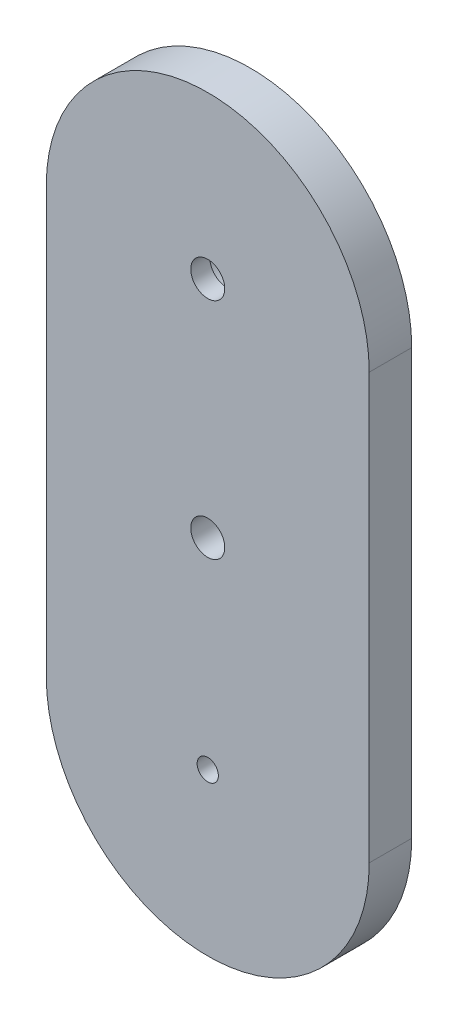
ISO-10303-21;
HEADER;
FILE_DESCRIPTION(('STEP AP214'),'2;1');
FILE_NAME('part.step','',(''),(''),'','','');
FILE_SCHEMA(('AUTOMOTIVE_DESIGN { 1 0 10303 214 1 1 1 1 }'));
ENDSEC;
DATA;
#1=APPLICATION_CONTEXT('core data for automotive mechanical design processes');
#2=APPLICATION_PROTOCOL_DEFINITION('international standard','automotive_design',2000,#1);
#3=PRODUCT_CONTEXT('',#1,'mechanical');
#4=PRODUCT('Part','Part','',(#3));
#5=PRODUCT_RELATED_PRODUCT_CATEGORY('part','',(#4));
#6=PRODUCT_DEFINITION_FORMATION('','',#4);
#7=PRODUCT_DEFINITION_CONTEXT('part definition',#1,'design');
#8=PRODUCT_DEFINITION('design','',#6,#7);
#9=PRODUCT_DEFINITION_SHAPE('','',#8);
#10=(LENGTH_UNIT() NAMED_UNIT(*) SI_UNIT(.MILLI.,.METRE.));
#11=(NAMED_UNIT(*) PLANE_ANGLE_UNIT() SI_UNIT($,.RADIAN.));
#12=(NAMED_UNIT(*) SI_UNIT($,.STERADIAN.) SOLID_ANGLE_UNIT());
#13=UNCERTAINTY_MEASURE_WITH_UNIT(LENGTH_MEASURE(1.E-05),#10,'distance_accuracy_value','');
#14=(GEOMETRIC_REPRESENTATION_CONTEXT(3) GLOBAL_UNCERTAINTY_ASSIGNED_CONTEXT((#13)) GLOBAL_UNIT_ASSIGNED_CONTEXT((#10,
#11,#12)) REPRESENTATION_CONTEXT('',''));
#15=CARTESIAN_POINT('',(0.,0.,0.));
#16=DIRECTION('',(0.,0.,1.));
#17=DIRECTION('',(1.,0.,0.));
#18=AXIS2_PLACEMENT_3D('',#15,#16,#17);
#19=CARTESIAN_POINT('',(0.,100.,10.));
#20=DIRECTION('',(0.,0.,-1.));
#21=DIRECTION('',(-1.,0.,0.));
#22=AXIS2_PLACEMENT_3D('',#19,#20,#21);
#23=CYLINDRICAL_SURFACE('',#22,8.);
#24=CARTESIAN_POINT('',(0.,100.,0.));
#25=DIRECTION('',(0.,0.,1.));
#26=DIRECTION('',(1.,0.,0.));
#27=AXIS2_PLACEMENT_3D('',#24,#25,#26);
#28=CIRCLE('',#27,8.);
#29=CARTESIAN_POINT('',(8.,100.,0.));
#30=VERTEX_POINT('',#29);
#31=EDGE_CURVE('E119',#30,#30,#28,.T.);
#32=ORIENTED_EDGE('',*,*,#31,.F.);
#33=EDGE_LOOP('',(#32));
#34=FACE_BOUND('',#33,.T.);
#35=CARTESIAN_POINT('',(0.,100.,5.5));
#36=DIRECTION('',(0.,0.,1.));
#37=DIRECTION('',(1.,0.,0.));
#38=AXIS2_PLACEMENT_3D('',#35,#36,#37);
#39=CIRCLE('',#38,8.);
#40=CARTESIAN_POINT('',(8.,100.,5.5));
#41=VERTEX_POINT('',#40);
#42=EDGE_CURVE('E153',#41,#41,#39,.T.);
#43=ORIENTED_EDGE('',*,*,#42,.T.);
#44=EDGE_LOOP('',(#43));
#45=FACE_BOUND('',#44,.T.);
#46=ADVANCED_FACE('F45',(#34,#45),#23,.F.);
#47=CARTESIAN_POINT('',(0.,0.,10.));
#48=DIRECTION('',(0.,0.,1.));
#49=DIRECTION('',(1.,0.,0.));
#50=AXIS2_PLACEMENT_3D('',#47,#48,#49);
#51=PLANE('',#50);
#52=CARTESIAN_POINT('',(0.,0.,10.));
#53=DIRECTION('',(0.,0.,1.));
#54=DIRECTION('',(1.,0.,0.));
#55=AXIS2_PLACEMENT_3D('',#52,#53,#54);
#56=CIRCLE('',#55,2.5);
#57=CARTESIAN_POINT('',(2.5,0.,10.));
#58=VERTEX_POINT('',#57);
#59=EDGE_CURVE('E140',#58,#58,#56,.T.);
#60=ORIENTED_EDGE('',*,*,#59,.F.);
#61=EDGE_LOOP('',(#60));
#62=FACE_BOUND('',#61,.T.);
#63=CARTESIAN_POINT('',(0.,0.,10.));
#64=DIRECTION('',(0.,0.,1.));
#65=DIRECTION('',(1.,0.,0.));
#66=AXIS2_PLACEMENT_3D('',#63,#64,#65);
#67=CIRCLE('',#66,38.);
#68=CARTESIAN_POINT('',(-38.,0.,10.));
#69=VERTEX_POINT('',#68);
#70=CARTESIAN_POINT('',(38.,0.,10.));
#71=VERTEX_POINT('',#70);
#72=EDGE_CURVE('E99',#69,#71,#67,.T.);
#73=ORIENTED_EDGE('',*,*,#72,.T.);
#74=DIRECTION('',(0.,1.,0.));
#75=VECTOR('',#74,1.);
#76=CARTESIAN_POINT('',(38.,0.,10.));
#77=LINE('',#76,#75);
#78=CARTESIAN_POINT('',(38.,100.,10.));
#79=VERTEX_POINT('',#78);
#80=EDGE_CURVE('E93',#71,#79,#77,.T.);
#81=ORIENTED_EDGE('',*,*,#80,.T.);
#82=CARTESIAN_POINT('',(0.,100.,10.));
#83=DIRECTION('',(0.,0.,1.));
#84=DIRECTION('',(1.,0.,0.));
#85=AXIS2_PLACEMENT_3D('',#82,#83,#84);
#86=CIRCLE('',#85,38.);
#87=CARTESIAN_POINT('',(-38.,100.,10.));
#88=VERTEX_POINT('',#87);
#89=EDGE_CURVE('E97',#79,#88,#86,.T.);
#90=ORIENTED_EDGE('',*,*,#89,.T.);
#91=DIRECTION('',(0.,-1.,0.));
#92=VECTOR('',#91,1.);
#93=CARTESIAN_POINT('',(-38.,0.,10.));
#94=LINE('',#93,#92);
#95=EDGE_CURVE('E63',#88,#69,#94,.T.);
#96=ORIENTED_EDGE('',*,*,#95,.T.);
#97=EDGE_LOOP('',(#73,#81,#90,#96));
#98=FACE_BOUND('',#97,.T.);
#99=CARTESIAN_POINT('',(-1.02049907716852E-13,47.25,10.));
#100=DIRECTION('',(0.,0.,1.));
#101=DIRECTION('',(1.,0.,0.));
#102=AXIS2_PLACEMENT_3D('',#99,#100,#101);
#103=CIRCLE('',#102,4.);
#104=CARTESIAN_POINT('',(3.9999999999999,47.25,10.));
#105=VERTEX_POINT('',#104);
#106=EDGE_CURVE('E145',#105,#105,#103,.T.);
#107=ORIENTED_EDGE('',*,*,#106,.F.);
#108=EDGE_LOOP('',(#107));
#109=FACE_BOUND('',#108,.T.);
#110=CARTESIAN_POINT('',(0.,100.,10.));
#111=DIRECTION('',(0.,0.,1.));
#112=DIRECTION('',(1.,0.,0.));
#113=AXIS2_PLACEMENT_3D('',#110,#111,#112);
#114=CIRCLE('',#113,4.);
#115=CARTESIAN_POINT('',(4.,100.,10.));
#116=VERTEX_POINT('',#115);
#117=EDGE_CURVE('E161',#116,#116,#114,.T.);
#118=ORIENTED_EDGE('',*,*,#117,.F.);
#119=EDGE_LOOP('',(#118));
#120=FACE_BOUND('',#119,.T.);
#121=ADVANCED_FACE('F94',(#62,#98,#109,#120),#51,.T.);
#122=CARTESIAN_POINT('',(0.,0.,0.));
#123=DIRECTION('',(0.,0.,1.));
#124=DIRECTION('',(1.,0.,0.));
#125=AXIS2_PLACEMENT_3D('',#122,#123,#124);
#126=PLANE('',#125);
#127=CARTESIAN_POINT('',(0.,0.,0.));
#128=DIRECTION('',(0.,0.,1.));
#129=DIRECTION('',(1.,0.,0.));
#130=AXIS2_PLACEMENT_3D('',#127,#128,#129);
#131=CIRCLE('',#130,38.);
#132=CARTESIAN_POINT('',(-38.,0.,0.));
#133=VERTEX_POINT('',#132);
#134=CARTESIAN_POINT('',(38.,0.,0.));
#135=VERTEX_POINT('',#134);
#136=EDGE_CURVE('E115',#133,#135,#131,.T.);
#137=ORIENTED_EDGE('',*,*,#136,.F.);
#138=DIRECTION('',(0.,-1.,0.));
#139=VECTOR('',#138,1.);
#140=CARTESIAN_POINT('',(-38.,0.,0.));
#141=LINE('',#140,#139);
#142=CARTESIAN_POINT('',(-38.,100.,0.));
#143=VERTEX_POINT('',#142);
#144=EDGE_CURVE('E86',#143,#133,#141,.T.);
#145=ORIENTED_EDGE('',*,*,#144,.F.);
#146=CARTESIAN_POINT('',(0.,100.,0.));
#147=DIRECTION('',(0.,0.,1.));
#148=DIRECTION('',(1.,0.,0.));
#149=AXIS2_PLACEMENT_3D('',#146,#147,#148);
#150=CIRCLE('',#149,38.);
#151=CARTESIAN_POINT('',(38.,100.,0.));
#152=VERTEX_POINT('',#151);
#153=EDGE_CURVE('E80',#152,#143,#150,.T.);
#154=ORIENTED_EDGE('',*,*,#153,.F.);
#155=DIRECTION('',(0.,1.,0.));
#156=VECTOR('',#155,1.);
#157=CARTESIAN_POINT('',(38.,0.,0.));
#158=LINE('',#157,#156);
#159=EDGE_CURVE('E104',#135,#152,#158,.T.);
#160=ORIENTED_EDGE('',*,*,#159,.F.);
#161=EDGE_LOOP('',(#137,#145,#154,#160));
#162=FACE_BOUND('',#161,.T.);
#163=ORIENTED_EDGE('',*,*,#31,.T.);
#164=EDGE_LOOP('',(#163));
#165=FACE_BOUND('',#164,.T.);
#166=CARTESIAN_POINT('',(0.,0.,0.));
#167=DIRECTION('',(0.,0.,1.));
#168=DIRECTION('',(1.,0.,0.));
#169=AXIS2_PLACEMENT_3D('',#166,#167,#168);
#170=CIRCLE('',#169,2.5);
#171=CARTESIAN_POINT('',(2.5,0.,0.));
#172=VERTEX_POINT('',#171);
#173=EDGE_CURVE('E141',#172,#172,#170,.T.);
#174=ORIENTED_EDGE('',*,*,#173,.T.);
#175=EDGE_LOOP('',(#174));
#176=FACE_BOUND('',#175,.T.);
#177=CARTESIAN_POINT('',(-1.02049907716852E-13,47.25,0.));
#178=DIRECTION('',(0.,0.,1.));
#179=DIRECTION('',(1.,0.,0.));
#180=AXIS2_PLACEMENT_3D('',#177,#178,#179);
#181=CIRCLE('',#180,4.);
#182=CARTESIAN_POINT('',(3.9999999999999,47.25,0.));
#183=VERTEX_POINT('',#182);
#184=EDGE_CURVE('E149',#183,#183,#181,.T.);
#185=ORIENTED_EDGE('',*,*,#184,.T.);
#186=EDGE_LOOP('',(#185));
#187=FACE_BOUND('',#186,.T.);
#188=ADVANCED_FACE('F132',(#162,#165,#176,#187),#126,.F.);
#189=CARTESIAN_POINT('',(0.,0.,10.));
#190=DIRECTION('',(0.,0.,-1.));
#191=DIRECTION('',(-1.,0.,0.));
#192=AXIS2_PLACEMENT_3D('',#189,#190,#191);
#193=CYLINDRICAL_SURFACE('',#192,38.);
#194=ORIENTED_EDGE('',*,*,#136,.T.);
#195=DIRECTION('',(0.,0.,-1.));
#196=VECTOR('',#195,1.);
#197=CARTESIAN_POINT('',(38.,0.,10.));
#198=LINE('',#197,#196);
#199=EDGE_CURVE('E11',#71,#135,#198,.T.);
#200=ORIENTED_EDGE('',*,*,#199,.F.);
#201=ORIENTED_EDGE('',*,*,#72,.F.);
#202=DIRECTION('',(0.,0.,-1.));
#203=VECTOR('',#202,1.);
#204=CARTESIAN_POINT('',(-38.,0.,10.));
#205=LINE('',#204,#203);
#206=EDGE_CURVE('E111',#69,#133,#205,.T.);
#207=ORIENTED_EDGE('',*,*,#206,.T.);
#208=EDGE_LOOP('',(#194,#200,#201,#207));
#209=FACE_BOUND('',#208,.T.);
#210=ADVANCED_FACE('F47',(#209),#193,.T.);
#211=CARTESIAN_POINT('',(38.,0.,10.));
#212=DIRECTION('',(-1.,0.,0.));
#213=DIRECTION('',(0.,0.,1.));
#214=AXIS2_PLACEMENT_3D('',#211,#212,#213);
#215=PLANE('',#214);
#216=ORIENTED_EDGE('',*,*,#159,.T.);
#217=DIRECTION('',(0.,0.,-1.));
#218=VECTOR('',#217,1.);
#219=CARTESIAN_POINT('',(38.,100.,10.));
#220=LINE('',#219,#218);
#221=EDGE_CURVE('E55',#79,#152,#220,.T.);
#222=ORIENTED_EDGE('',*,*,#221,.F.);
#223=ORIENTED_EDGE('',*,*,#80,.F.);
#224=ORIENTED_EDGE('',*,*,#199,.T.);
#225=EDGE_LOOP('',(#216,#222,#223,#224));
#226=FACE_BOUND('',#225,.T.);
#227=ADVANCED_FACE('F103',(#226),#215,.F.);
#228=CARTESIAN_POINT('',(0.,100.,10.));
#229=DIRECTION('',(0.,0.,-1.));
#230=DIRECTION('',(-1.,0.,0.));
#231=AXIS2_PLACEMENT_3D('',#228,#229,#230);
#232=CYLINDRICAL_SURFACE('',#231,38.);
#233=ORIENTED_EDGE('',*,*,#153,.T.);
#234=DIRECTION('',(0.,0.,-1.));
#235=VECTOR('',#234,1.);
#236=CARTESIAN_POINT('',(-38.,100.,10.));
#237=LINE('',#236,#235);
#238=EDGE_CURVE('E106',#88,#143,#237,.T.);
#239=ORIENTED_EDGE('',*,*,#238,.F.);
#240=ORIENTED_EDGE('',*,*,#89,.F.);
#241=ORIENTED_EDGE('',*,*,#221,.T.);
#242=EDGE_LOOP('',(#233,#239,#240,#241));
#243=FACE_BOUND('',#242,.T.);
#244=ADVANCED_FACE('F107',(#243),#232,.T.);
#245=CARTESIAN_POINT('',(-38.,0.,10.));
#246=DIRECTION('',(1.,0.,0.));
#247=DIRECTION('',(0.,0.,-1.));
#248=AXIS2_PLACEMENT_3D('',#245,#246,#247);
#249=PLANE('',#248);
#250=ORIENTED_EDGE('',*,*,#144,.T.);
#251=ORIENTED_EDGE('',*,*,#206,.F.);
#252=ORIENTED_EDGE('',*,*,#95,.F.);
#253=ORIENTED_EDGE('',*,*,#238,.T.);
#254=EDGE_LOOP('',(#250,#251,#252,#253));
#255=FACE_BOUND('',#254,.T.);
#256=ADVANCED_FACE('F129',(#255),#249,.F.);
#257=CARTESIAN_POINT('',(0.,0.,10.));
#258=DIRECTION('',(0.,0.,-1.));
#259=DIRECTION('',(-1.,0.,0.));
#260=AXIS2_PLACEMENT_3D('',#257,#258,#259);
#261=CYLINDRICAL_SURFACE('',#260,2.5);
#262=ORIENTED_EDGE('',*,*,#59,.T.);
#263=EDGE_LOOP('',(#262));
#264=FACE_BOUND('',#263,.T.);
#265=ORIENTED_EDGE('',*,*,#173,.F.);
#266=EDGE_LOOP('',(#265));
#267=FACE_BOUND('',#266,.T.);
#268=ADVANCED_FACE('F194',(#264,#267),#261,.F.);
#269=CARTESIAN_POINT('',(-1.02049907716852E-13,47.25,10.));
#270=DIRECTION('',(0.,0.,-1.));
#271=DIRECTION('',(-1.,0.,0.));
#272=AXIS2_PLACEMENT_3D('',#269,#270,#271);
#273=CYLINDRICAL_SURFACE('',#272,4.);
#274=ORIENTED_EDGE('',*,*,#106,.T.);
#275=EDGE_LOOP('',(#274));
#276=FACE_BOUND('',#275,.T.);
#277=ORIENTED_EDGE('',*,*,#184,.F.);
#278=EDGE_LOOP('',(#277));
#279=FACE_BOUND('',#278,.T.);
#280=ADVANCED_FACE('F228',(#276,#279),#273,.F.);
#281=CARTESIAN_POINT('',(0.,100.,5.5));
#282=DIRECTION('',(0.,0.,1.));
#283=DIRECTION('',(1.,0.,0.));
#284=AXIS2_PLACEMENT_3D('',#281,#282,#283);
#285=PLANE('',#284);
#286=CARTESIAN_POINT('',(0.,100.,5.5));
#287=DIRECTION('',(0.,0.,1.));
#288=DIRECTION('',(1.,0.,0.));
#289=AXIS2_PLACEMENT_3D('',#286,#287,#288);
#290=CIRCLE('',#289,4.);
#291=CARTESIAN_POINT('',(4.,100.,5.5));
#292=VERTEX_POINT('',#291);
#293=EDGE_CURVE('E160',#292,#292,#290,.T.);
#294=ORIENTED_EDGE('',*,*,#293,.T.);
#295=EDGE_LOOP('',(#294));
#296=FACE_BOUND('',#295,.T.);
#297=ORIENTED_EDGE('',*,*,#42,.F.);
#298=EDGE_LOOP('',(#297));
#299=FACE_BOUND('',#298,.T.);
#300=ADVANCED_FACE('F169',(#296,#299),#285,.F.);
#301=CARTESIAN_POINT('',(0.,100.,5.5));
#302=DIRECTION('',(0.,0.,1.));
#303=DIRECTION('',(1.,0.,0.));
#304=AXIS2_PLACEMENT_3D('',#301,#302,#303);
#305=CYLINDRICAL_SURFACE('',#304,4.);
#306=ORIENTED_EDGE('',*,*,#293,.F.);
#307=EDGE_LOOP('',(#306));
#308=FACE_BOUND('',#307,.T.);
#309=ORIENTED_EDGE('',*,*,#117,.T.);
#310=EDGE_LOOP('',(#309));
#311=FACE_BOUND('',#310,.T.);
#312=ADVANCED_FACE('F172',(#308,#311),#305,.F.);
#313=CLOSED_SHELL('',(#46,#121,#188,#210,#227,#244,#256,#268,#280,#300,#312));
#314=MANIFOLD_SOLID_BREP('B2',#313);
#315=ADVANCED_BREP_SHAPE_REPRESENTATION('',(#18,#314),#14);
#316=SHAPE_DEFINITION_REPRESENTATION(#9,#315);
ENDSEC;
END-ISO-10303-21;
